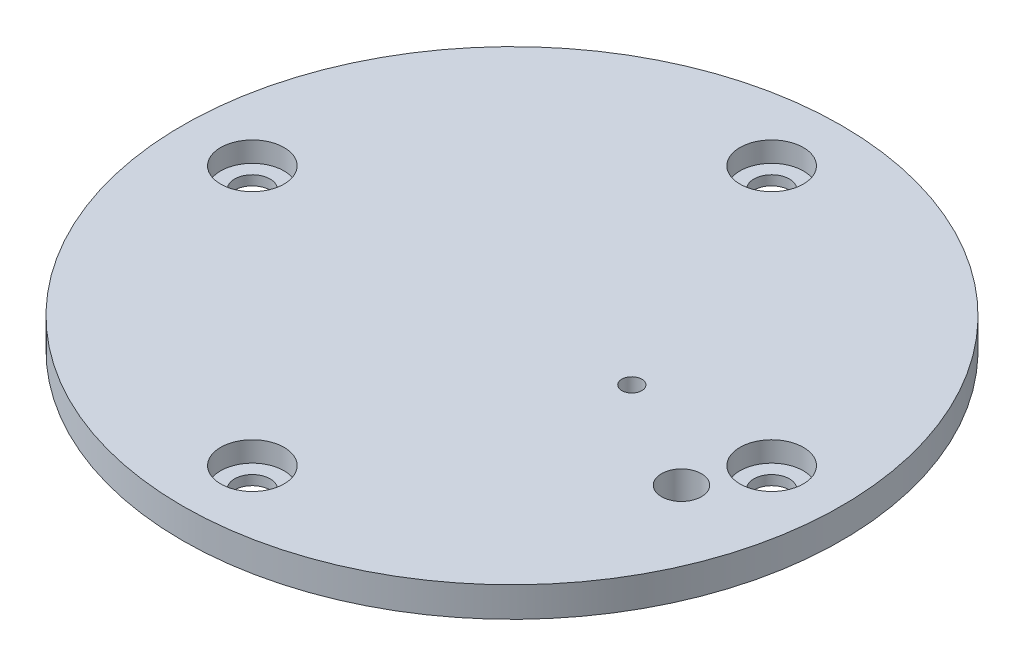
ISO-10303-21;
HEADER;
FILE_DESCRIPTION(('STEP AP214'),'2;1');
FILE_NAME('part.step','',(''),(''),'','','');
FILE_SCHEMA(('AUTOMOTIVE_DESIGN { 1 0 10303 214 1 1 1 1 }'));
ENDSEC;
DATA;
#1=APPLICATION_CONTEXT('core data for automotive mechanical design processes');
#2=APPLICATION_PROTOCOL_DEFINITION('international standard','automotive_design',2000,#1);
#3=PRODUCT_CONTEXT('',#1,'mechanical');
#4=PRODUCT('Part','Part','',(#3));
#5=PRODUCT_RELATED_PRODUCT_CATEGORY('part','',(#4));
#6=PRODUCT_DEFINITION_FORMATION('','',#4);
#7=PRODUCT_DEFINITION_CONTEXT('part definition',#1,'design');
#8=PRODUCT_DEFINITION('design','',#6,#7);
#9=PRODUCT_DEFINITION_SHAPE('','',#8);
#10=(LENGTH_UNIT() NAMED_UNIT(*) SI_UNIT(.MILLI.,.METRE.));
#11=(NAMED_UNIT(*) PLANE_ANGLE_UNIT() SI_UNIT($,.RADIAN.));
#12=(NAMED_UNIT(*) SI_UNIT($,.STERADIAN.) SOLID_ANGLE_UNIT());
#13=UNCERTAINTY_MEASURE_WITH_UNIT(LENGTH_MEASURE(1.E-05),#10,'distance_accuracy_value','');
#14=(GEOMETRIC_REPRESENTATION_CONTEXT(3) GLOBAL_UNCERTAINTY_ASSIGNED_CONTEXT((#13)) GLOBAL_UNIT_ASSIGNED_CONTEXT((#10,
#11,#12)) REPRESENTATION_CONTEXT('',''));
#15=CARTESIAN_POINT('',(0.,0.,0.));
#16=DIRECTION('',(0.,0.,1.));
#17=DIRECTION('',(1.,0.,0.));
#18=AXIS2_PLACEMENT_3D('',#15,#16,#17);
#19=CARTESIAN_POINT('',(0.,1.5,0.));
#20=DIRECTION('',(0.,-1.,0.));
#21=DIRECTION('',(0.,0.,-1.));
#22=AXIS2_PLACEMENT_3D('',#19,#20,#21);
#23=CYLINDRICAL_SURFACE('',#22,16.5);
#24=CARTESIAN_POINT('',(0.,1.5,0.));
#25=DIRECTION('',(0.,1.,0.));
#26=DIRECTION('',(0.,0.,1.));
#27=AXIS2_PLACEMENT_3D('',#24,#25,#26);
#28=CIRCLE('',#27,16.5);
#29=CARTESIAN_POINT('',(0.,1.5,16.5));
#30=VERTEX_POINT('',#29);
#31=EDGE_CURVE('E10',#30,#30,#28,.T.);
#32=ORIENTED_EDGE('',*,*,#31,.F.);
#33=EDGE_LOOP('',(#32));
#34=FACE_BOUND('',#33,.T.);
#35=CARTESIAN_POINT('',(0.,0.,0.));
#36=DIRECTION('',(0.,1.,0.));
#37=DIRECTION('',(0.,0.,1.));
#38=AXIS2_PLACEMENT_3D('',#35,#36,#37);
#39=CIRCLE('',#38,16.5);
#40=CARTESIAN_POINT('',(0.,0.,16.5));
#41=VERTEX_POINT('',#40);
#42=EDGE_CURVE('E40',#41,#41,#39,.T.);
#43=ORIENTED_EDGE('',*,*,#42,.T.);
#44=EDGE_LOOP('',(#43));
#45=FACE_BOUND('',#44,.T.);
#46=ADVANCED_FACE('F33',(#34,#45),#23,.T.);
#47=CARTESIAN_POINT('',(0.,1.5,0.));
#48=DIRECTION('',(0.,1.,0.));
#49=DIRECTION('',(0.,0.,1.));
#50=AXIS2_PLACEMENT_3D('',#47,#48,#49);
#51=PLANE('',#50);
#52=CARTESIAN_POINT('',(11.5911099154688,1.5,3.10582854123017));
#53=DIRECTION('',(0.,1.,0.));
#54=DIRECTION('',(0.,0.,1.));
#55=AXIS2_PLACEMENT_3D('',#52,#53,#54);
#56=CIRCLE('',#55,1.);
#57=CARTESIAN_POINT('',(11.5911099154688,1.5,4.10582854123017));
#58=VERTEX_POINT('',#57);
#59=EDGE_CURVE('E100',#58,#58,#56,.T.);
#60=ORIENTED_EDGE('',*,*,#59,.F.);
#61=EDGE_LOOP('',(#60));
#62=FACE_BOUND('',#61,.T.);
#63=CARTESIAN_POINT('',(6.,1.5,0.));
#64=DIRECTION('',(0.,-1.,0.));
#65=DIRECTION('',(0.,0.,-1.));
#66=AXIS2_PLACEMENT_3D('',#63,#64,#65);
#67=CIRCLE('',#66,0.500000000000001);
#68=CARTESIAN_POINT('',(6.,1.5,-0.500000000000001));
#69=VERTEX_POINT('',#68);
#70=EDGE_CURVE('E72',#69,#69,#67,.T.);
#71=ORIENTED_EDGE('',*,*,#70,.T.);
#72=EDGE_LOOP('',(#71));
#73=FACE_BOUND('',#72,.T.);
#74=CARTESIAN_POINT('',(0.,1.5,-13.));
#75=DIRECTION('',(0.,1.,0.));
#76=DIRECTION('',(1.,0.,0.));
#77=AXIS2_PLACEMENT_3D('',#74,#75,#76);
#78=CIRCLE('',#77,1.5875);
#79=CARTESIAN_POINT('',(1.58749999999996,1.5,-13.));
#80=VERTEX_POINT('',#79);
#81=EDGE_CURVE('E76',#80,#80,#78,.T.);
#82=ORIENTED_EDGE('',*,*,#81,.F.);
#83=EDGE_LOOP('',(#82));
#84=FACE_BOUND('',#83,.T.);
#85=CARTESIAN_POINT('',(-13.,1.5,0.));
#86=DIRECTION('',(0.,1.,0.));
#87=DIRECTION('',(0.,0.,-1.));
#88=AXIS2_PLACEMENT_3D('',#85,#86,#87);
#89=CIRCLE('',#88,1.5875);
#90=CARTESIAN_POINT('',(-13.,1.5,-1.5875));
#91=VERTEX_POINT('',#90);
#92=EDGE_CURVE('E62',#91,#91,#89,.T.);
#93=ORIENTED_EDGE('',*,*,#92,.F.);
#94=EDGE_LOOP('',(#93));
#95=FACE_BOUND('',#94,.T.);
#96=CARTESIAN_POINT('',(1.36167772214882E-13,1.5,13.));
#97=DIRECTION('',(0.,1.,0.));
#98=DIRECTION('',(-1.,0.,0.));
#99=AXIS2_PLACEMENT_3D('',#96,#97,#98);
#100=CIRCLE('',#99,1.5875);
#101=CARTESIAN_POINT('',(-1.58749999999986,1.5,13.));
#102=VERTEX_POINT('',#101);
#103=EDGE_CURVE('E69',#102,#102,#100,.T.);
#104=ORIENTED_EDGE('',*,*,#103,.F.);
#105=EDGE_LOOP('',(#104));
#106=FACE_BOUND('',#105,.T.);
#107=CARTESIAN_POINT('',(13.,1.5,0.));
#108=DIRECTION('',(0.,1.,0.));
#109=DIRECTION('',(0.,0.,1.));
#110=AXIS2_PLACEMENT_3D('',#107,#108,#109);
#111=CIRCLE('',#110,1.5875);
#112=CARTESIAN_POINT('',(13.,1.5,1.5875));
#113=VERTEX_POINT('',#112);
#114=EDGE_CURVE('E55',#113,#113,#111,.T.);
#115=ORIENTED_EDGE('',*,*,#114,.F.);
#116=EDGE_LOOP('',(#115));
#117=FACE_BOUND('',#116,.T.);
#118=ORIENTED_EDGE('',*,*,#31,.T.);
#119=EDGE_LOOP('',(#118));
#120=FACE_BOUND('',#119,.T.);
#121=ADVANCED_FACE('F121',(#62,#73,#84,#95,#106,#117,#120),#51,.T.);
#122=CARTESIAN_POINT('',(0.,0.,0.));
#123=DIRECTION('',(0.,1.,0.));
#124=DIRECTION('',(0.,0.,1.));
#125=AXIS2_PLACEMENT_3D('',#122,#123,#124);
#126=PLANE('',#125);
#127=CARTESIAN_POINT('',(11.5911099154688,0.,3.10582854123017));
#128=DIRECTION('',(0.,1.,0.));
#129=DIRECTION('',(0.,0.,1.));
#130=AXIS2_PLACEMENT_3D('',#127,#128,#129);
#131=CIRCLE('',#130,1.);
#132=CARTESIAN_POINT('',(11.5911099154688,0.,4.10582854123017));
#133=VERTEX_POINT('',#132);
#134=EDGE_CURVE('E36',#133,#133,#131,.T.);
#135=ORIENTED_EDGE('',*,*,#134,.T.);
#136=EDGE_LOOP('',(#135));
#137=FACE_BOUND('',#136,.T.);
#138=CARTESIAN_POINT('',(6.,0.,0.));
#139=DIRECTION('',(0.,-1.,0.));
#140=DIRECTION('',(0.,0.,-1.));
#141=AXIS2_PLACEMENT_3D('',#138,#139,#140);
#142=CIRCLE('',#141,0.500000000000001);
#143=CARTESIAN_POINT('',(6.,0.,-0.500000000000001));
#144=VERTEX_POINT('',#143);
#145=EDGE_CURVE('E95',#144,#144,#142,.T.);
#146=ORIENTED_EDGE('',*,*,#145,.F.);
#147=EDGE_LOOP('',(#146));
#148=FACE_BOUND('',#147,.T.);
#149=CARTESIAN_POINT('',(0.,0.,-13.));
#150=DIRECTION('',(0.,1.,0.));
#151=DIRECTION('',(1.,0.,0.));
#152=AXIS2_PLACEMENT_3D('',#149,#150,#151);
#153=CIRCLE('',#152,0.888999999999999);
#154=CARTESIAN_POINT('',(0.888999999999954,0.,-13.));
#155=VERTEX_POINT('',#154);
#156=EDGE_CURVE('E90',#155,#155,#153,.T.);
#157=ORIENTED_EDGE('',*,*,#156,.T.);
#158=EDGE_LOOP('',(#157));
#159=FACE_BOUND('',#158,.T.);
#160=CARTESIAN_POINT('',(-13.,0.,0.));
#161=DIRECTION('',(0.,1.,0.));
#162=DIRECTION('',(0.,0.,-1.));
#163=AXIS2_PLACEMENT_3D('',#160,#161,#162);
#164=CIRCLE('',#163,0.888999999999999);
#165=CARTESIAN_POINT('',(-13.,0.,-0.888999999999999));
#166=VERTEX_POINT('',#165);
#167=EDGE_CURVE('E80',#166,#166,#164,.T.);
#168=ORIENTED_EDGE('',*,*,#167,.T.);
#169=EDGE_LOOP('',(#168));
#170=FACE_BOUND('',#169,.T.);
#171=CARTESIAN_POINT('',(1.36167772214882E-13,0.,13.));
#172=DIRECTION('',(0.,1.,0.));
#173=DIRECTION('',(-1.,0.,0.));
#174=AXIS2_PLACEMENT_3D('',#171,#172,#173);
#175=CIRCLE('',#174,0.888999999999999);
#176=CARTESIAN_POINT('',(-0.888999999999863,0.,13.));
#177=VERTEX_POINT('',#176);
#178=EDGE_CURVE('E66',#177,#177,#175,.T.);
#179=ORIENTED_EDGE('',*,*,#178,.T.);
#180=EDGE_LOOP('',(#179));
#181=FACE_BOUND('',#180,.T.);
#182=CARTESIAN_POINT('',(13.,0.,0.));
#183=DIRECTION('',(0.,1.,0.));
#184=DIRECTION('',(0.,0.,1.));
#185=AXIS2_PLACEMENT_3D('',#182,#183,#184);
#186=CIRCLE('',#185,0.888999999999999);
#187=CARTESIAN_POINT('',(13.,0.,0.888999999999999));
#188=VERTEX_POINT('',#187);
#189=EDGE_CURVE('E45',#188,#188,#186,.T.);
#190=ORIENTED_EDGE('',*,*,#189,.T.);
#191=EDGE_LOOP('',(#190));
#192=FACE_BOUND('',#191,.T.);
#193=ORIENTED_EDGE('',*,*,#42,.F.);
#194=EDGE_LOOP('',(#193));
#195=FACE_BOUND('',#194,.T.);
#196=ADVANCED_FACE('F107',(#137,#148,#159,#170,#181,#192,#195),#126,.F.);
#197=CARTESIAN_POINT('',(13.,1.5,0.));
#198=DIRECTION('',(0.,1.,0.));
#199=DIRECTION('',(0.,0.,1.));
#200=AXIS2_PLACEMENT_3D('',#197,#198,#199);
#201=CYLINDRICAL_SURFACE('',#200,0.888999999999999);
#202=ORIENTED_EDGE('',*,*,#189,.F.);
#203=EDGE_LOOP('',(#202));
#204=FACE_BOUND('',#203,.T.);
#205=CARTESIAN_POINT('',(13.,0.484,0.));
#206=DIRECTION('',(0.,1.,0.));
#207=DIRECTION('',(0.,0.,1.));
#208=AXIS2_PLACEMENT_3D('',#205,#206,#207);
#209=CIRCLE('',#208,0.888999999999999);
#210=CARTESIAN_POINT('',(13.,0.484,0.888999999999999));
#211=VERTEX_POINT('',#210);
#212=EDGE_CURVE('E49',#211,#211,#209,.T.);
#213=ORIENTED_EDGE('',*,*,#212,.T.);
#214=EDGE_LOOP('',(#213));
#215=FACE_BOUND('',#214,.T.);
#216=ADVANCED_FACE('F132',(#204,#215),#201,.F.);
#217=CARTESIAN_POINT('',(13.889,0.484,0.));
#218=DIRECTION('',(0.,-1.,0.));
#219=DIRECTION('',(0.,0.,-1.));
#220=AXIS2_PLACEMENT_3D('',#217,#218,#219);
#221=PLANE('',#220);
#222=ORIENTED_EDGE('',*,*,#212,.F.);
#223=EDGE_LOOP('',(#222));
#224=FACE_BOUND('',#223,.T.);
#225=CARTESIAN_POINT('',(13.,0.484,0.));
#226=DIRECTION('',(0.,1.,0.));
#227=DIRECTION('',(0.,0.,1.));
#228=AXIS2_PLACEMENT_3D('',#225,#226,#227);
#229=CIRCLE('',#228,1.5875);
#230=CARTESIAN_POINT('',(13.,0.484,1.5875));
#231=VERTEX_POINT('',#230);
#232=EDGE_CURVE('E52',#231,#231,#229,.T.);
#233=ORIENTED_EDGE('',*,*,#232,.T.);
#234=EDGE_LOOP('',(#233));
#235=FACE_BOUND('',#234,.T.);
#236=ADVANCED_FACE('F136',(#224,#235),#221,.F.);
#237=CARTESIAN_POINT('',(13.,1.5,0.));
#238=DIRECTION('',(0.,1.,0.));
#239=DIRECTION('',(0.,0.,1.));
#240=AXIS2_PLACEMENT_3D('',#237,#238,#239);
#241=CYLINDRICAL_SURFACE('',#240,1.5875);
#242=ORIENTED_EDGE('',*,*,#232,.F.);
#243=EDGE_LOOP('',(#242));
#244=FACE_BOUND('',#243,.T.);
#245=ORIENTED_EDGE('',*,*,#114,.T.);
#246=EDGE_LOOP('',(#245));
#247=FACE_BOUND('',#246,.T.);
#248=ADVANCED_FACE('F142',(#244,#247),#241,.F.);
#249=CARTESIAN_POINT('',(1.36167772214882E-13,1.5,13.));
#250=DIRECTION('',(0.,1.,0.));
#251=DIRECTION('',(-1.,0.,0.));
#252=AXIS2_PLACEMENT_3D('',#249,#250,#251);
#253=CYLINDRICAL_SURFACE('',#252,0.888999999999999);
#254=ORIENTED_EDGE('',*,*,#178,.F.);
#255=EDGE_LOOP('',(#254));
#256=FACE_BOUND('',#255,.T.);
#257=CARTESIAN_POINT('',(1.36167772214882E-13,0.484,13.));
#258=DIRECTION('',(0.,1.,0.));
#259=DIRECTION('',(-1.,0.,0.));
#260=AXIS2_PLACEMENT_3D('',#257,#258,#259);
#261=CIRCLE('',#260,0.888999999999999);
#262=CARTESIAN_POINT('',(-0.888999999999863,0.484,13.));
#263=VERTEX_POINT('',#262);
#264=EDGE_CURVE('E59',#263,#263,#261,.T.);
#265=ORIENTED_EDGE('',*,*,#264,.T.);
#266=EDGE_LOOP('',(#265));
#267=FACE_BOUND('',#266,.T.);
#268=ADVANCED_FACE('F146',(#256,#267),#253,.F.);
#269=CARTESIAN_POINT('',(1.45479552945577E-13,0.484,13.889));
#270=DIRECTION('',(0.,-1.,0.));
#271=DIRECTION('',(1.,0.,0.));
#272=AXIS2_PLACEMENT_3D('',#269,#270,#271);
#273=PLANE('',#272);
#274=ORIENTED_EDGE('',*,*,#264,.F.);
#275=EDGE_LOOP('',(#274));
#276=FACE_BOUND('',#275,.T.);
#277=CARTESIAN_POINT('',(1.36167772214882E-13,0.484,13.));
#278=DIRECTION('',(0.,1.,0.));
#279=DIRECTION('',(-1.,0.,0.));
#280=AXIS2_PLACEMENT_3D('',#277,#278,#279);
#281=CIRCLE('',#280,1.5875);
#282=CARTESIAN_POINT('',(-1.58749999999986,0.484,13.));
#283=VERTEX_POINT('',#282);
#284=EDGE_CURVE('E63',#283,#283,#281,.T.);
#285=ORIENTED_EDGE('',*,*,#284,.T.);
#286=EDGE_LOOP('',(#285));
#287=FACE_BOUND('',#286,.T.);
#288=ADVANCED_FACE('F150',(#276,#287),#273,.F.);
#289=CARTESIAN_POINT('',(1.36167772214882E-13,1.5,13.));
#290=DIRECTION('',(0.,1.,0.));
#291=DIRECTION('',(-1.,0.,0.));
#292=AXIS2_PLACEMENT_3D('',#289,#290,#291);
#293=CYLINDRICAL_SURFACE('',#292,1.5875);
#294=ORIENTED_EDGE('',*,*,#284,.F.);
#295=EDGE_LOOP('',(#294));
#296=FACE_BOUND('',#295,.T.);
#297=ORIENTED_EDGE('',*,*,#103,.T.);
#298=EDGE_LOOP('',(#297));
#299=FACE_BOUND('',#298,.T.);
#300=ADVANCED_FACE('F154',(#296,#299),#293,.F.);
#301=CARTESIAN_POINT('',(-13.,1.5,0.));
#302=DIRECTION('',(0.,1.,0.));
#303=DIRECTION('',(0.,0.,-1.));
#304=AXIS2_PLACEMENT_3D('',#301,#302,#303);
#305=CYLINDRICAL_SURFACE('',#304,0.888999999999999);
#306=ORIENTED_EDGE('',*,*,#167,.F.);
#307=EDGE_LOOP('',(#306));
#308=FACE_BOUND('',#307,.T.);
#309=CARTESIAN_POINT('',(-13.,0.484,0.));
#310=DIRECTION('',(0.,1.,0.));
#311=DIRECTION('',(0.,0.,-1.));
#312=AXIS2_PLACEMENT_3D('',#309,#310,#311);
#313=CIRCLE('',#312,0.888999999999999);
#314=CARTESIAN_POINT('',(-13.,0.484,-0.888999999999999));
#315=VERTEX_POINT('',#314);
#316=EDGE_CURVE('E73',#315,#315,#313,.T.);
#317=ORIENTED_EDGE('',*,*,#316,.T.);
#318=EDGE_LOOP('',(#317));
#319=FACE_BOUND('',#318,.T.);
#320=ADVANCED_FACE('F158',(#308,#319),#305,.F.);
#321=CARTESIAN_POINT('',(-13.889,0.484,0.));
#322=DIRECTION('',(0.,-1.,0.));
#323=DIRECTION('',(0.,0.,1.));
#324=AXIS2_PLACEMENT_3D('',#321,#322,#323);
#325=PLANE('',#324);
#326=ORIENTED_EDGE('',*,*,#316,.F.);
#327=EDGE_LOOP('',(#326));
#328=FACE_BOUND('',#327,.T.);
#329=CARTESIAN_POINT('',(-13.,0.484,0.));
#330=DIRECTION('',(0.,1.,0.));
#331=DIRECTION('',(0.,0.,-1.));
#332=AXIS2_PLACEMENT_3D('',#329,#330,#331);
#333=CIRCLE('',#332,1.5875);
#334=CARTESIAN_POINT('',(-13.,0.484,-1.5875));
#335=VERTEX_POINT('',#334);
#336=EDGE_CURVE('E77',#335,#335,#333,.T.);
#337=ORIENTED_EDGE('',*,*,#336,.T.);
#338=EDGE_LOOP('',(#337));
#339=FACE_BOUND('',#338,.T.);
#340=ADVANCED_FACE('F162',(#328,#339),#325,.F.);
#341=CARTESIAN_POINT('',(-13.,1.5,0.));
#342=DIRECTION('',(0.,1.,0.));
#343=DIRECTION('',(0.,0.,-1.));
#344=AXIS2_PLACEMENT_3D('',#341,#342,#343);
#345=CYLINDRICAL_SURFACE('',#344,1.5875);
#346=ORIENTED_EDGE('',*,*,#336,.F.);
#347=EDGE_LOOP('',(#346));
#348=FACE_BOUND('',#347,.T.);
#349=ORIENTED_EDGE('',*,*,#92,.T.);
#350=EDGE_LOOP('',(#349));
#351=FACE_BOUND('',#350,.T.);
#352=ADVANCED_FACE('F166',(#348,#351),#345,.F.);
#353=CARTESIAN_POINT('',(0.,1.5,-13.));
#354=DIRECTION('',(0.,1.,0.));
#355=DIRECTION('',(1.,0.,0.));
#356=AXIS2_PLACEMENT_3D('',#353,#354,#355);
#357=CYLINDRICAL_SURFACE('',#356,0.888999999999999);
#358=ORIENTED_EDGE('',*,*,#156,.F.);
#359=EDGE_LOOP('',(#358));
#360=FACE_BOUND('',#359,.T.);
#361=CARTESIAN_POINT('',(0.,0.484,-13.));
#362=DIRECTION('',(0.,1.,0.));
#363=DIRECTION('',(1.,0.,0.));
#364=AXIS2_PLACEMENT_3D('',#361,#362,#363);
#365=CIRCLE('',#364,0.888999999999999);
#366=CARTESIAN_POINT('',(0.888999999999954,0.484,-13.));
#367=VERTEX_POINT('',#366);
#368=EDGE_CURVE('E58',#367,#367,#365,.T.);
#369=ORIENTED_EDGE('',*,*,#368,.T.);
#370=EDGE_LOOP('',(#369));
#371=FACE_BOUND('',#370,.T.);
#372=ADVANCED_FACE('F170',(#360,#371),#357,.F.);
#373=CARTESIAN_POINT('',(0.,0.484,-13.889));
#374=DIRECTION('',(0.,-1.,0.));
#375=DIRECTION('',(-1.,0.,0.));
#376=AXIS2_PLACEMENT_3D('',#373,#374,#375);
#377=PLANE('',#376);
#378=ORIENTED_EDGE('',*,*,#368,.F.);
#379=EDGE_LOOP('',(#378));
#380=FACE_BOUND('',#379,.T.);
#381=CARTESIAN_POINT('',(0.,0.484,-13.));
#382=DIRECTION('',(0.,1.,0.));
#383=DIRECTION('',(1.,0.,0.));
#384=AXIS2_PLACEMENT_3D('',#381,#382,#383);
#385=CIRCLE('',#384,1.5875);
#386=CARTESIAN_POINT('',(1.58749999999995,0.484,-13.));
#387=VERTEX_POINT('',#386);
#388=EDGE_CURVE('E87',#387,#387,#385,.T.);
#389=ORIENTED_EDGE('',*,*,#388,.T.);
#390=EDGE_LOOP('',(#389));
#391=FACE_BOUND('',#390,.T.);
#392=ADVANCED_FACE('F174',(#380,#391),#377,.F.);
#393=CARTESIAN_POINT('',(0.,1.5,-13.));
#394=DIRECTION('',(0.,1.,0.));
#395=DIRECTION('',(1.,0.,0.));
#396=AXIS2_PLACEMENT_3D('',#393,#394,#395);
#397=CYLINDRICAL_SURFACE('',#396,1.5875);
#398=ORIENTED_EDGE('',*,*,#388,.F.);
#399=EDGE_LOOP('',(#398));
#400=FACE_BOUND('',#399,.T.);
#401=ORIENTED_EDGE('',*,*,#81,.T.);
#402=EDGE_LOOP('',(#401));
#403=FACE_BOUND('',#402,.T.);
#404=ADVANCED_FACE('F117',(#400,#403),#397,.F.);
#405=CARTESIAN_POINT('',(6.,1.5,0.));
#406=DIRECTION('',(0.,-1.,0.));
#407=DIRECTION('',(0.,0.,-1.));
#408=AXIS2_PLACEMENT_3D('',#405,#406,#407);
#409=CYLINDRICAL_SURFACE('',#408,0.500000000000001);
#410=ORIENTED_EDGE('',*,*,#70,.F.);
#411=EDGE_LOOP('',(#410));
#412=FACE_BOUND('',#411,.T.);
#413=ORIENTED_EDGE('',*,*,#145,.T.);
#414=EDGE_LOOP('',(#413));
#415=FACE_BOUND('',#414,.T.);
#416=ADVANCED_FACE('F112',(#412,#415),#409,.F.);
#417=CARTESIAN_POINT('',(11.5911099154688,-8.5,3.10582854123017));
#418=DIRECTION('',(0.,1.,0.));
#419=DIRECTION('',(0.,0.,1.));
#420=AXIS2_PLACEMENT_3D('',#417,#418,#419);
#421=CYLINDRICAL_SURFACE('',#420,1.);
#422=ORIENTED_EDGE('',*,*,#59,.T.);
#423=EDGE_LOOP('',(#422));
#424=FACE_BOUND('',#423,.T.);
#425=ORIENTED_EDGE('',*,*,#134,.F.);
#426=EDGE_LOOP('',(#425));
#427=FACE_BOUND('',#426,.T.);
#428=ADVANCED_FACE('F110',(#424,#427),#421,.F.);
#429=CLOSED_SHELL('',(#46,#121,#196,#216,#236,#248,#268,#288,#300,#320,#340,#352,#372,#392,#404,
#416,#428));
#430=MANIFOLD_SOLID_BREP('B2',#429);
#431=ADVANCED_BREP_SHAPE_REPRESENTATION('',(#18,#430),#14);
#432=SHAPE_DEFINITION_REPRESENTATION(#9,#431);
ENDSEC;
END-ISO-10303-21;
